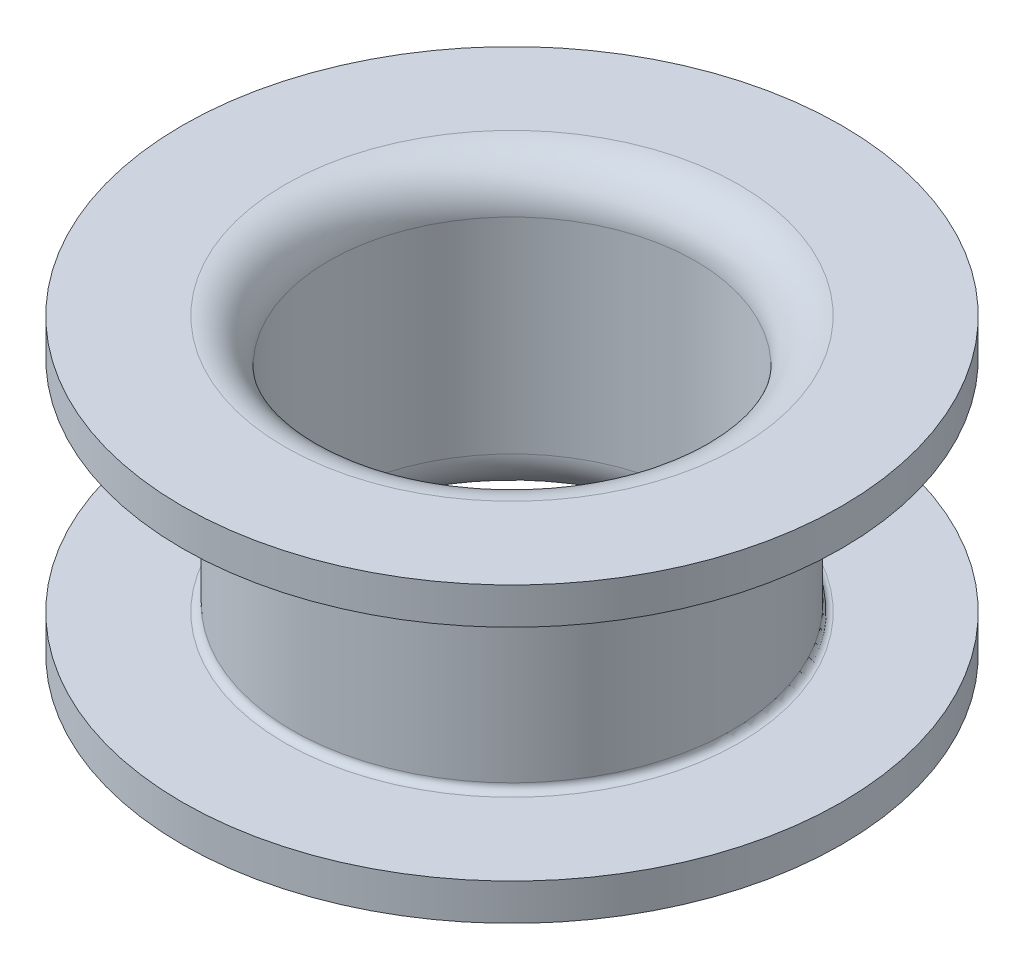
ISO-10303-21;
HEADER;
FILE_DESCRIPTION(('STEP AP214'),'2;1');
FILE_NAME('part.step','',(''),(''),'','','');
FILE_SCHEMA(('AUTOMOTIVE_DESIGN { 1 0 10303 214 1 1 1 1 }'));
ENDSEC;
DATA;
#1=APPLICATION_CONTEXT('core data for automotive mechanical design processes');
#2=APPLICATION_PROTOCOL_DEFINITION('international standard','automotive_design',2000,#1);
#3=PRODUCT_CONTEXT('',#1,'mechanical');
#4=PRODUCT('Part','Part','',(#3));
#5=PRODUCT_RELATED_PRODUCT_CATEGORY('part','',(#4));
#6=PRODUCT_DEFINITION_FORMATION('','',#4);
#7=PRODUCT_DEFINITION_CONTEXT('part definition',#1,'design');
#8=PRODUCT_DEFINITION('design','',#6,#7);
#9=PRODUCT_DEFINITION_SHAPE('','',#8);
#10=(LENGTH_UNIT() NAMED_UNIT(*) SI_UNIT(.MILLI.,.METRE.));
#11=(NAMED_UNIT(*) PLANE_ANGLE_UNIT() SI_UNIT($,.RADIAN.));
#12=(NAMED_UNIT(*) SI_UNIT($,.STERADIAN.) SOLID_ANGLE_UNIT());
#13=UNCERTAINTY_MEASURE_WITH_UNIT(LENGTH_MEASURE(1.E-05),#10,'distance_accuracy_value','');
#14=(GEOMETRIC_REPRESENTATION_CONTEXT(3) GLOBAL_UNCERTAINTY_ASSIGNED_CONTEXT((#13)) GLOBAL_UNIT_ASSIGNED_CONTEXT((#10,
#11,#12)) REPRESENTATION_CONTEXT('',''));
#15=CARTESIAN_POINT('',(0.,0.,0.));
#16=DIRECTION('',(0.,0.,1.));
#17=DIRECTION('',(1.,0.,0.));
#18=AXIS2_PLACEMENT_3D('',#15,#16,#17);
#19=CARTESIAN_POINT('',(0.,0.,0.));
#20=DIRECTION('',(0.,-1.,0.));
#21=DIRECTION('',(0.,0.,-1.));
#22=AXIS2_PLACEMENT_3D('',#19,#20,#21);
#23=CYLINDRICAL_SURFACE('',#22,9.);
#24=CARTESIAN_POINT('',(0.,0.999999999999996,0.));
#25=DIRECTION('',(0.,-1.,0.));
#26=DIRECTION('',(0.,0.,-1.));
#27=AXIS2_PLACEMENT_3D('',#24,#25,#26);
#28=CIRCLE('',#27,9.);
#29=CARTESIAN_POINT('',(0.,0.999999999999996,-9.));
#30=VERTEX_POINT('',#29);
#31=EDGE_CURVE('E71',#30,#30,#28,.T.);
#32=ORIENTED_EDGE('',*,*,#31,.T.);
#33=EDGE_LOOP('',(#32));
#34=FACE_BOUND('',#33,.T.);
#35=CARTESIAN_POINT('',(0.,0.,0.));
#36=DIRECTION('',(0.,-1.,0.));
#37=DIRECTION('',(0.,0.,-1.));
#38=AXIS2_PLACEMENT_3D('',#35,#36,#37);
#39=CIRCLE('',#38,9.);
#40=CARTESIAN_POINT('',(0.,0.,-9.));
#41=VERTEX_POINT('',#40);
#42=EDGE_CURVE('E10',#41,#41,#39,.T.);
#43=ORIENTED_EDGE('',*,*,#42,.F.);
#44=EDGE_LOOP('',(#43));
#45=FACE_BOUND('',#44,.T.);
#46=ADVANCED_FACE('F31',(#34,#45),#23,.T.);
#47=CARTESIAN_POINT('',(6.2,0.,0.));
#48=DIRECTION('',(0.,-1.,0.));
#49=DIRECTION('',(0.,0.,-1.));
#50=AXIS2_PLACEMENT_3D('',#47,#48,#49);
#51=PLANE('',#50);
#52=ORIENTED_EDGE('',*,*,#42,.T.);
#53=EDGE_LOOP('',(#52));
#54=FACE_BOUND('',#53,.T.);
#55=CARTESIAN_POINT('',(0.,0.,0.));
#56=DIRECTION('',(0.,-1.,0.));
#57=DIRECTION('',(0.,0.,-1.));
#58=AXIS2_PLACEMENT_3D('',#55,#56,#57);
#59=CIRCLE('',#58,6.2);
#60=CARTESIAN_POINT('',(0.,0.,-6.2));
#61=VERTEX_POINT('',#60);
#62=EDGE_CURVE('E37',#61,#61,#59,.T.);
#63=ORIENTED_EDGE('',*,*,#62,.F.);
#64=EDGE_LOOP('',(#63));
#65=FACE_BOUND('',#64,.T.);
#66=ADVANCED_FACE('F89',(#54,#65),#51,.T.);
#67=CARTESIAN_POINT('',(0.,1.2,0.));
#68=DIRECTION('',(0.,-1.,0.));
#69=DIRECTION('',(0.,0.,-1.));
#70=AXIS2_PLACEMENT_3D('',#67,#68,#69);
#71=TOROIDAL_SURFACE('',#70,6.2,1.2);
#72=ORIENTED_EDGE('',*,*,#62,.T.);
#73=EDGE_LOOP('',(#72));
#74=FACE_BOUND('',#73,.T.);
#75=CARTESIAN_POINT('',(0.,1.2,0.));
#76=DIRECTION('',(0.,-1.,0.));
#77=DIRECTION('',(0.,0.,-1.));
#78=AXIS2_PLACEMENT_3D('',#75,#76,#77);
#79=CIRCLE('',#78,5.);
#80=CARTESIAN_POINT('',(0.,1.2,-5.));
#81=VERTEX_POINT('',#80);
#82=EDGE_CURVE('E41',#81,#81,#79,.T.);
#83=ORIENTED_EDGE('',*,*,#82,.F.);
#84=EDGE_LOOP('',(#83));
#85=FACE_BOUND('',#84,.T.);
#86=ADVANCED_FACE('F93',(#74,#85),#71,.T.);
#87=CARTESIAN_POINT('',(0.,0.,0.));
#88=DIRECTION('',(0.,-1.,0.));
#89=DIRECTION('',(0.,0.,-1.));
#90=AXIS2_PLACEMENT_3D('',#87,#88,#89);
#91=CYLINDRICAL_SURFACE('',#90,5.);
#92=ORIENTED_EDGE('',*,*,#82,.T.);
#93=EDGE_LOOP('',(#92));
#94=FACE_BOUND('',#93,.T.);
#95=CARTESIAN_POINT('',(0.,6.8,0.));
#96=DIRECTION('',(0.,-1.,0.));
#97=DIRECTION('',(0.,0.,-1.));
#98=AXIS2_PLACEMENT_3D('',#95,#96,#97);
#99=CIRCLE('',#98,5.);
#100=CARTESIAN_POINT('',(0.,6.8,-5.));
#101=VERTEX_POINT('',#100);
#102=EDGE_CURVE('E45',#101,#101,#99,.T.);
#103=ORIENTED_EDGE('',*,*,#102,.F.);
#104=EDGE_LOOP('',(#103));
#105=FACE_BOUND('',#104,.T.);
#106=ADVANCED_FACE('F97',(#94,#105),#91,.F.);
#107=CARTESIAN_POINT('',(0.,6.8,0.));
#108=DIRECTION('',(0.,-1.,0.));
#109=DIRECTION('',(0.,0.,-1.));
#110=AXIS2_PLACEMENT_3D('',#107,#108,#109);
#111=TOROIDAL_SURFACE('',#110,6.2,1.2);
#112=ORIENTED_EDGE('',*,*,#102,.T.);
#113=EDGE_LOOP('',(#112));
#114=FACE_BOUND('',#113,.T.);
#115=CARTESIAN_POINT('',(0.,8.,0.));
#116=DIRECTION('',(0.,-1.,0.));
#117=DIRECTION('',(0.,0.,-1.));
#118=AXIS2_PLACEMENT_3D('',#115,#116,#117);
#119=CIRCLE('',#118,6.2);
#120=CARTESIAN_POINT('',(0.,8.,-6.2));
#121=VERTEX_POINT('',#120);
#122=EDGE_CURVE('E50',#121,#121,#119,.T.);
#123=ORIENTED_EDGE('',*,*,#122,.F.);
#124=EDGE_LOOP('',(#123));
#125=FACE_BOUND('',#124,.T.);
#126=ADVANCED_FACE('F103',(#114,#125),#111,.T.);
#127=CARTESIAN_POINT('',(9.,8.,0.));
#128=DIRECTION('',(0.,1.,0.));
#129=DIRECTION('',(0.,0.,1.));
#130=AXIS2_PLACEMENT_3D('',#127,#128,#129);
#131=PLANE('',#130);
#132=ORIENTED_EDGE('',*,*,#122,.T.);
#133=EDGE_LOOP('',(#132));
#134=FACE_BOUND('',#133,.T.);
#135=CARTESIAN_POINT('',(0.,8.,0.));
#136=DIRECTION('',(0.,-1.,0.));
#137=DIRECTION('',(0.,0.,-1.));
#138=AXIS2_PLACEMENT_3D('',#135,#136,#137);
#139=CIRCLE('',#138,9.);
#140=CARTESIAN_POINT('',(0.,8.,-9.));
#141=VERTEX_POINT('',#140);
#142=EDGE_CURVE('E53',#141,#141,#139,.T.);
#143=ORIENTED_EDGE('',*,*,#142,.F.);
#144=EDGE_LOOP('',(#143));
#145=FACE_BOUND('',#144,.T.);
#146=ADVANCED_FACE('F107',(#134,#145),#131,.T.);
#147=CARTESIAN_POINT('',(0.,0.,0.));
#148=DIRECTION('',(0.,-1.,0.));
#149=DIRECTION('',(0.,0.,-1.));
#150=AXIS2_PLACEMENT_3D('',#147,#148,#149);
#151=CYLINDRICAL_SURFACE('',#150,9.);
#152=ORIENTED_EDGE('',*,*,#142,.T.);
#153=EDGE_LOOP('',(#152));
#154=FACE_BOUND('',#153,.T.);
#155=CARTESIAN_POINT('',(0.,7.,0.));
#156=DIRECTION('',(0.,-1.,0.));
#157=DIRECTION('',(0.,0.,-1.));
#158=AXIS2_PLACEMENT_3D('',#155,#156,#157);
#159=CIRCLE('',#158,9.);
#160=CARTESIAN_POINT('',(0.,7.,-9.));
#161=VERTEX_POINT('',#160);
#162=EDGE_CURVE('E56',#161,#161,#159,.T.);
#163=ORIENTED_EDGE('',*,*,#162,.F.);
#164=EDGE_LOOP('',(#163));
#165=FACE_BOUND('',#164,.T.);
#166=ADVANCED_FACE('F111',(#154,#165),#151,.T.);
#167=CARTESIAN_POINT('',(6.2,7.,0.));
#168=DIRECTION('',(0.,-1.,0.));
#169=DIRECTION('',(0.,0.,-1.));
#170=AXIS2_PLACEMENT_3D('',#167,#168,#169);
#171=PLANE('',#170);
#172=ORIENTED_EDGE('',*,*,#162,.T.);
#173=EDGE_LOOP('',(#172));
#174=FACE_BOUND('',#173,.T.);
#175=CARTESIAN_POINT('',(0.,7.,0.));
#176=DIRECTION('',(0.,-1.,0.));
#177=DIRECTION('',(0.,0.,-1.));
#178=AXIS2_PLACEMENT_3D('',#175,#176,#177);
#179=CIRCLE('',#178,6.2);
#180=CARTESIAN_POINT('',(0.,7.,-6.2));
#181=VERTEX_POINT('',#180);
#182=EDGE_CURVE('E59',#181,#181,#179,.T.);
#183=ORIENTED_EDGE('',*,*,#182,.F.);
#184=EDGE_LOOP('',(#183));
#185=FACE_BOUND('',#184,.T.);
#186=ADVANCED_FACE('F115',(#174,#185),#171,.T.);
#187=CARTESIAN_POINT('',(0.,6.8,0.));
#188=DIRECTION('',(0.,-1.,0.));
#189=DIRECTION('',(0.,0.,-1.));
#190=AXIS2_PLACEMENT_3D('',#187,#188,#189);
#191=TOROIDAL_SURFACE('',#190,6.2,0.2);
#192=ORIENTED_EDGE('',*,*,#182,.T.);
#193=EDGE_LOOP('',(#192));
#194=FACE_BOUND('',#193,.T.);
#195=CARTESIAN_POINT('',(0.,6.8,0.));
#196=DIRECTION('',(0.,-1.,0.));
#197=DIRECTION('',(0.,0.,-1.));
#198=AXIS2_PLACEMENT_3D('',#195,#196,#197);
#199=CIRCLE('',#198,6.);
#200=CARTESIAN_POINT('',(0.,6.8,-6.));
#201=VERTEX_POINT('',#200);
#202=EDGE_CURVE('E62',#201,#201,#199,.T.);
#203=ORIENTED_EDGE('',*,*,#202,.F.);
#204=EDGE_LOOP('',(#203));
#205=FACE_BOUND('',#204,.T.);
#206=ADVANCED_FACE('F119',(#194,#205),#191,.F.);
#207=CARTESIAN_POINT('',(0.,0.,0.));
#208=DIRECTION('',(0.,-1.,0.));
#209=DIRECTION('',(0.,0.,-1.));
#210=AXIS2_PLACEMENT_3D('',#207,#208,#209);
#211=CYLINDRICAL_SURFACE('',#210,6.);
#212=ORIENTED_EDGE('',*,*,#202,.T.);
#213=EDGE_LOOP('',(#212));
#214=FACE_BOUND('',#213,.T.);
#215=CARTESIAN_POINT('',(0.,1.2,0.));
#216=DIRECTION('',(0.,-1.,0.));
#217=DIRECTION('',(0.,0.,-1.));
#218=AXIS2_PLACEMENT_3D('',#215,#216,#217);
#219=CIRCLE('',#218,6.);
#220=CARTESIAN_POINT('',(0.,1.2,-6.));
#221=VERTEX_POINT('',#220);
#222=EDGE_CURVE('E65',#221,#221,#219,.T.);
#223=ORIENTED_EDGE('',*,*,#222,.F.);
#224=EDGE_LOOP('',(#223));
#225=FACE_BOUND('',#224,.T.);
#226=ADVANCED_FACE('F85',(#214,#225),#211,.T.);
#227=CARTESIAN_POINT('',(0.,1.2,0.));
#228=DIRECTION('',(0.,-1.,0.));
#229=DIRECTION('',(0.,0.,-1.));
#230=AXIS2_PLACEMENT_3D('',#227,#228,#229);
#231=TOROIDAL_SURFACE('',#230,6.2,0.2);
#232=ORIENTED_EDGE('',*,*,#222,.T.);
#233=EDGE_LOOP('',(#232));
#234=FACE_BOUND('',#233,.T.);
#235=CARTESIAN_POINT('',(0.,1.,0.));
#236=DIRECTION('',(0.,-1.,0.));
#237=DIRECTION('',(0.,0.,-1.));
#238=AXIS2_PLACEMENT_3D('',#235,#236,#237);
#239=CIRCLE('',#238,6.2);
#240=CARTESIAN_POINT('',(0.,1.,-6.2));
#241=VERTEX_POINT('',#240);
#242=EDGE_CURVE('E68',#241,#241,#239,.T.);
#243=ORIENTED_EDGE('',*,*,#242,.F.);
#244=EDGE_LOOP('',(#243));
#245=FACE_BOUND('',#244,.T.);
#246=ADVANCED_FACE('F79',(#234,#245),#231,.F.);
#247=CARTESIAN_POINT('',(9.,0.999999999999996,0.));
#248=DIRECTION('',(0.,1.,0.));
#249=DIRECTION('',(0.,0.,1.));
#250=AXIS2_PLACEMENT_3D('',#247,#248,#249);
#251=PLANE('',#250);
#252=ORIENTED_EDGE('',*,*,#242,.T.);
#253=EDGE_LOOP('',(#252));
#254=FACE_BOUND('',#253,.T.);
#255=ORIENTED_EDGE('',*,*,#31,.F.);
#256=EDGE_LOOP('',(#255));
#257=FACE_BOUND('',#256,.T.);
#258=ADVANCED_FACE('F77',(#254,#257),#251,.T.);
#259=CLOSED_SHELL('',(#46,#66,#86,#106,#126,#146,#166,#186,#206,#226,#246,#258));
#260=MANIFOLD_SOLID_BREP('B2',#259);
#261=ADVANCED_BREP_SHAPE_REPRESENTATION('',(#18,#260),#14);
#262=SHAPE_DEFINITION_REPRESENTATION(#9,#261);
ENDSEC;
END-ISO-10303-21;
